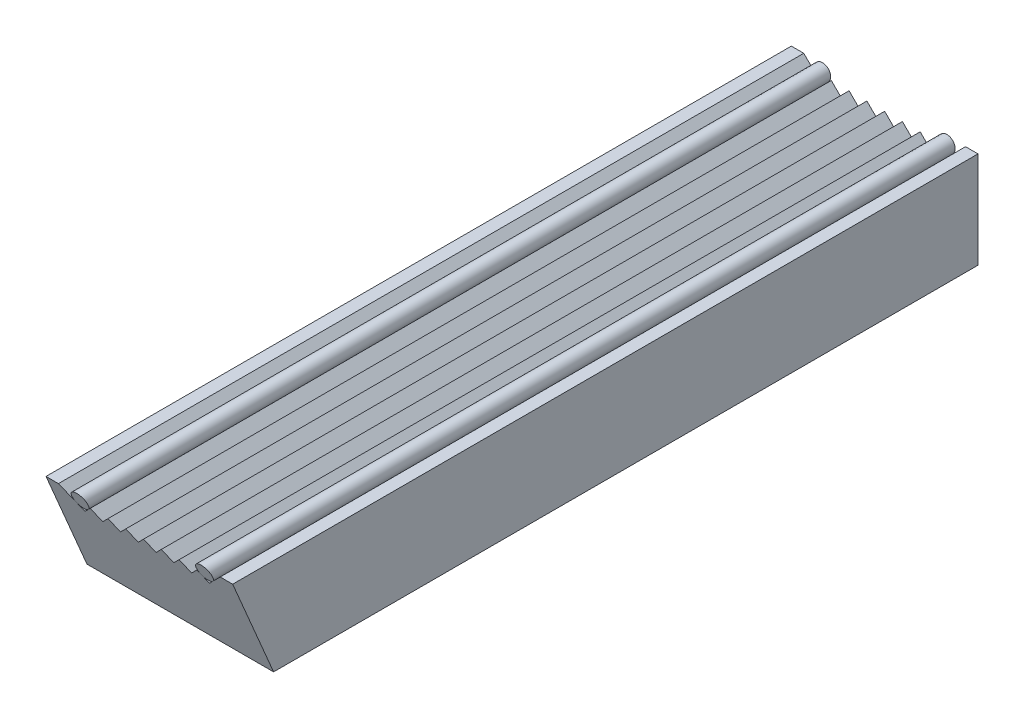
ISO-10303-21;
HEADER;
FILE_DESCRIPTION(('STEP AP214'),'2;1');
FILE_NAME('part.step','',(''),(''),'','','');
FILE_SCHEMA(('AUTOMOTIVE_DESIGN { 1 0 10303 214 1 1 1 1 }'));
ENDSEC;
DATA;
#1=APPLICATION_CONTEXT('core data for automotive mechanical design processes');
#2=APPLICATION_PROTOCOL_DEFINITION('international standard','automotive_design',2000,#1);
#3=PRODUCT_CONTEXT('',#1,'mechanical');
#4=PRODUCT('Part','Part','',(#3));
#5=PRODUCT_RELATED_PRODUCT_CATEGORY('part','',(#4));
#6=PRODUCT_DEFINITION_FORMATION('','',#4);
#7=PRODUCT_DEFINITION_CONTEXT('part definition',#1,'design');
#8=PRODUCT_DEFINITION('design','',#6,#7);
#9=PRODUCT_DEFINITION_SHAPE('','',#8);
#10=(LENGTH_UNIT() NAMED_UNIT(*) SI_UNIT(.MILLI.,.METRE.));
#11=(NAMED_UNIT(*) PLANE_ANGLE_UNIT() SI_UNIT($,.RADIAN.));
#12=(NAMED_UNIT(*) SI_UNIT($,.STERADIAN.) SOLID_ANGLE_UNIT());
#13=UNCERTAINTY_MEASURE_WITH_UNIT(LENGTH_MEASURE(1.E-05),#10,'distance_accuracy_value','');
#14=(GEOMETRIC_REPRESENTATION_CONTEXT(3) GLOBAL_UNCERTAINTY_ASSIGNED_CONTEXT((#13)) GLOBAL_UNIT_ASSIGNED_CONTEXT((#10,
#11,#12)) REPRESENTATION_CONTEXT('',''));
#15=CARTESIAN_POINT('',(0.,0.,0.));
#16=DIRECTION('',(0.,0.,1.));
#17=DIRECTION('',(1.,0.,0.));
#18=AXIS2_PLACEMENT_3D('',#15,#16,#17);
#19=CARTESIAN_POINT('',(0.5,-0.112548339959391,12.3220940394581));
#20=DIRECTION('',(0.,0.,-1.));
#21=DIRECTION('',(-1.,0.,0.));
#22=AXIS2_PLACEMENT_3D('',#19,#20,#21);
#23=CYLINDRICAL_SURFACE('',#22,0.13254833995939);
#24=CARTESIAN_POINT('',(0.5,-0.112548339959391,11.9310023232706));
#25=DIRECTION('',(0.,0.390731128489267,-0.920504853452443));
#26=DIRECTION('',(0.,-0.920504853452443,-0.390731128489267));
#27=AXIS2_PLACEMENT_3D('',#24,#25,#26);
#28=ELLIPSE('',#27,0.143995264622728,0.13254833995939);
#29=CARTESIAN_POINT('',(0.5,-0.245096679918781,11.8747388910274));
#30=VERTEX_POINT('',#29);
#31=EDGE_CURVE('E11',#30,#30,#28,.F.);
#32=ORIENTED_EDGE('',*,*,#31,.F.);
#33=EDGE_LOOP('',(#32));
#34=FACE_BOUND('',#33,.T.);
#35=CARTESIAN_POINT('',(0.5,-0.112548339959391,0.));
#36=DIRECTION('',(0.,0.,-1.));
#37=DIRECTION('',(-1.,0.,0.));
#38=AXIS2_PLACEMENT_3D('',#35,#36,#37);
#39=CIRCLE('',#38,0.13254833995939);
#40=CARTESIAN_POINT('',(0.36745166004061,-0.112548339959391,0.));
#41=VERTEX_POINT('',#40);
#42=EDGE_CURVE('E48',#41,#41,#39,.T.);
#43=ORIENTED_EDGE('',*,*,#42,.F.);
#44=EDGE_LOOP('',(#43));
#45=FACE_BOUND('',#44,.T.);
#46=ADVANCED_FACE('F42',(#34,#45),#23,.T.);
#47=CARTESIAN_POINT('',(0.5,-0.112548339959391,0.));
#48=DIRECTION('',(0.,0.,-1.));
#49=DIRECTION('',(-1.,0.,0.));
#50=AXIS2_PLACEMENT_3D('',#47,#48,#49);
#51=PLANE('',#50);
#52=ORIENTED_EDGE('',*,*,#42,.T.);
#53=EDGE_LOOP('',(#52));
#54=FACE_BOUND('',#53,.T.);
#55=ADVANCED_FACE('F54',(#54),#51,.T.);
#56=CARTESIAN_POINT('',(0.,0.0500000000000012,12.));
#57=DIRECTION('',(0.,0.390731128489267,-0.920504853452443));
#58=DIRECTION('',(0.,0.920504853452443,0.390731128489267));
#59=AXIS2_PLACEMENT_3D('',#56,#57,#58);
#60=PLANE('',#59);
#61=ORIENTED_EDGE('',*,*,#31,.T.);
#62=EDGE_LOOP('',(#61));
#63=FACE_BOUND('',#62,.T.);
#64=ADVANCED_FACE('F61',(#63),#60,.F.);
#65=CLOSED_SHELL('',(#46,#55,#64));
#66=MANIFOLD_SOLID_BREP('B2',#65);
#67=CARTESIAN_POINT('',(2.5,-0.11254833995939,12.3220940394581));
#68=DIRECTION('',(0.,0.,-1.));
#69=DIRECTION('',(-1.,0.,0.));
#70=AXIS2_PLACEMENT_3D('',#67,#68,#69);
#71=CYLINDRICAL_SURFACE('',#70,0.13254833995939);
#72=CARTESIAN_POINT('',(2.5,-0.11254833995939,11.9310023232706));
#73=DIRECTION('',(0.,0.390731128489267,-0.920504853452443));
#74=DIRECTION('',(0.,-0.920504853452443,-0.390731128489267));
#75=AXIS2_PLACEMENT_3D('',#72,#73,#74);
#76=ELLIPSE('',#75,0.143995264622728,0.13254833995939);
#77=CARTESIAN_POINT('',(2.5,-0.24509667991878,11.8747388910274));
#78=VERTEX_POINT('',#77);
#79=EDGE_CURVE('E41',#78,#78,#76,.F.);
#80=ORIENTED_EDGE('',*,*,#79,.F.);
#81=EDGE_LOOP('',(#80));
#82=FACE_BOUND('',#81,.T.);
#83=CARTESIAN_POINT('',(2.5,-0.11254833995939,0.));
#84=DIRECTION('',(0.,0.,-1.));
#85=DIRECTION('',(-1.,0.,0.));
#86=AXIS2_PLACEMENT_3D('',#83,#84,#85);
#87=CIRCLE('',#86,0.13254833995939);
#88=CARTESIAN_POINT('',(2.36745166004061,-0.11254833995939,0.));
#89=VERTEX_POINT('',#88);
#90=EDGE_CURVE('E92',#89,#89,#87,.T.);
#91=ORIENTED_EDGE('',*,*,#90,.F.);
#92=EDGE_LOOP('',(#91));
#93=FACE_BOUND('',#92,.T.);
#94=ADVANCED_FACE('F86',(#82,#93),#71,.T.);
#95=CARTESIAN_POINT('',(2.5,-0.11254833995939,0.));
#96=DIRECTION('',(0.,0.,-1.));
#97=DIRECTION('',(-1.,0.,0.));
#98=AXIS2_PLACEMENT_3D('',#95,#96,#97);
#99=PLANE('',#98);
#100=ORIENTED_EDGE('',*,*,#90,.T.);
#101=EDGE_LOOP('',(#100));
#102=FACE_BOUND('',#101,.T.);
#103=ADVANCED_FACE('F98',(#102),#99,.T.);
#104=CARTESIAN_POINT('',(0.,0.0500000000000012,12.));
#105=DIRECTION('',(0.,0.390731128489267,-0.920504853452443));
#106=DIRECTION('',(0.,0.920504853452443,0.390731128489267));
#107=AXIS2_PLACEMENT_3D('',#104,#105,#106);
#108=PLANE('',#107);
#109=ORIENTED_EDGE('',*,*,#79,.T.);
#110=EDGE_LOOP('',(#109));
#111=FACE_BOUND('',#110,.T.);
#112=ADVANCED_FACE('F105',(#111),#108,.F.);
#113=CLOSED_SHELL('',(#94,#103,#112));
#114=MANIFOLD_SOLID_BREP('B6',#113);
#115=CARTESIAN_POINT('',(3.,0.,12.));
#116=DIRECTION('',(0.,-1.,0.));
#117=DIRECTION('',(1.,0.,0.));
#118=AXIS2_PLACEMENT_3D('',#115,#116,#117);
#119=PLANE('',#118);
#120=DIRECTION('',(0.,0.,1.));
#121=VECTOR('',#120,1.);
#122=CARTESIAN_POINT('',(2.8,0.,0.));
#123=LINE('',#122,#121);
#124=CARTESIAN_POINT('',(2.8,0.,0.));
#125=VERTEX_POINT('',#124);
#126=CARTESIAN_POINT('',(2.8,0.,11.9787762591895));
#127=VERTEX_POINT('',#126);
#128=EDGE_CURVE('E355',#125,#127,#123,.T.);
#129=ORIENTED_EDGE('',*,*,#128,.T.);
#130=DIRECTION('',(1.,0.,0.));
#131=VECTOR('',#130,1.);
#132=CARTESIAN_POINT('',(3.,0.,11.9787762591895));
#133=LINE('',#132,#131);
#134=CARTESIAN_POINT('',(3.,0.,11.9787762591895));
#135=VERTEX_POINT('',#134);
#136=EDGE_CURVE('E403',#127,#135,#133,.T.);
#137=ORIENTED_EDGE('',*,*,#136,.T.);
#138=DIRECTION('',(0.,0.,-1.));
#139=VECTOR('',#138,1.);
#140=CARTESIAN_POINT('',(3.,0.,12.));
#141=LINE('',#140,#139);
#142=CARTESIAN_POINT('',(3.,0.,0.));
#143=VERTEX_POINT('',#142);
#144=EDGE_CURVE('E293',#135,#143,#141,.T.);
#145=ORIENTED_EDGE('',*,*,#144,.T.);
#146=DIRECTION('',(-1.,0.,0.));
#147=VECTOR('',#146,1.);
#148=CARTESIAN_POINT('',(3.,0.,0.));
#149=LINE('',#148,#147);
#150=EDGE_CURVE('E303',#143,#125,#149,.T.);
#151=ORIENTED_EDGE('',*,*,#150,.T.);
#152=EDGE_LOOP('',(#129,#137,#145,#151));
#153=FACE_BOUND('',#152,.T.);
#154=ADVANCED_FACE('F127',(#153),#119,.F.);
#155=DIRECTION('',(0.,0.,-1.));
#156=VECTOR('',#155,1.);
#157=CARTESIAN_POINT('',(0.,0.,12.));
#158=LINE('',#157,#156);
#159=CARTESIAN_POINT('',(0.,0.,11.9787762591895));
#160=VERTEX_POINT('',#159);
#161=CARTESIAN_POINT('',(0.,0.,0.));
#162=VERTEX_POINT('',#161);
#163=EDGE_CURVE('E135',#160,#162,#158,.T.);
#164=ORIENTED_EDGE('',*,*,#163,.F.);
#165=DIRECTION('',(1.,0.,0.));
#166=VECTOR('',#165,1.);
#167=CARTESIAN_POINT('',(3.,0.,11.9787762591895));
#168=LINE('',#167,#166);
#169=CARTESIAN_POINT('',(0.2,0.,11.9787762591895));
#170=VERTEX_POINT('',#169);
#171=EDGE_CURVE('E274',#160,#170,#168,.T.);
#172=ORIENTED_EDGE('',*,*,#171,.T.);
#173=DIRECTION('',(0.,0.,1.));
#174=VECTOR('',#173,1.);
#175=CARTESIAN_POINT('',(0.2,0.,0.));
#176=LINE('',#175,#174);
#177=CARTESIAN_POINT('',(0.2,0.,0.));
#178=VERTEX_POINT('',#177);
#179=EDGE_CURVE('E307',#178,#170,#176,.T.);
#180=ORIENTED_EDGE('',*,*,#179,.F.);
#181=EDGE_CURVE('E306',#178,#162,#149,.T.);
#182=ORIENTED_EDGE('',*,*,#181,.T.);
#183=EDGE_LOOP('',(#164,#172,#180,#182));
#184=FACE_BOUND('',#183,.T.);
#185=ADVANCED_FACE('F129',(#184),#119,.F.);
#186=CARTESIAN_POINT('',(0.,0.,12.));
#187=DIRECTION('',(1.,0.,0.));
#188=DIRECTION('',(0.,1.,0.));
#189=AXIS2_PLACEMENT_3D('',#186,#187,#188);
#190=PLANE('',#189);
#191=DIRECTION('',(0.,0.,-1.));
#192=VECTOR('',#191,1.);
#193=CARTESIAN_POINT('',(0.,-1.55,12.));
#194=LINE('',#193,#192);
#195=CARTESIAN_POINT('',(0.,-1.55,11.3208402940646));
#196=VERTEX_POINT('',#195);
#197=CARTESIAN_POINT('',(0.,-1.55,0.));
#198=VERTEX_POINT('',#197);
#199=EDGE_CURVE('E284',#196,#198,#194,.T.);
#200=ORIENTED_EDGE('',*,*,#199,.F.);
#201=DIRECTION('',(0.,0.920504853452443,0.390731128489267));
#202=VECTOR('',#201,1.);
#203=CARTESIAN_POINT('',(0.,0.0500000000000012,12.));
#204=LINE('',#203,#202);
#205=EDGE_CURVE('E268',#196,#160,#204,.T.);
#206=ORIENTED_EDGE('',*,*,#205,.T.);
#207=ORIENTED_EDGE('',*,*,#163,.T.);
#208=DIRECTION('',(0.,-1.,0.));
#209=VECTOR('',#208,1.);
#210=CARTESIAN_POINT('',(0.,0.,0.));
#211=LINE('',#210,#209);
#212=EDGE_CURVE('E290',#162,#198,#211,.T.);
#213=ORIENTED_EDGE('',*,*,#212,.T.);
#214=EDGE_LOOP('',(#200,#206,#207,#213));
#215=FACE_BOUND('',#214,.T.);
#216=ADVANCED_FACE('F288',(#215),#190,.F.);
#217=CARTESIAN_POINT('',(0.,-1.55,12.));
#218=DIRECTION('',(0.,1.,0.));
#219=DIRECTION('',(-1.,0.,0.));
#220=AXIS2_PLACEMENT_3D('',#217,#218,#219);
#221=PLANE('',#220);
#222=DIRECTION('',(0.,0.,-1.));
#223=VECTOR('',#222,1.);
#224=CARTESIAN_POINT('',(3.,-1.55,12.));
#225=LINE('',#224,#223);
#226=CARTESIAN_POINT('',(3.,-1.55,11.3208402940646));
#227=VERTEX_POINT('',#226);
#228=CARTESIAN_POINT('',(3.,-1.55,0.));
#229=VERTEX_POINT('',#228);
#230=EDGE_CURVE('E286',#227,#229,#225,.T.);
#231=ORIENTED_EDGE('',*,*,#230,.F.);
#232=DIRECTION('',(1.,0.,0.));
#233=VECTOR('',#232,1.);
#234=CARTESIAN_POINT('',(0.,-1.55,11.3208402940646));
#235=LINE('',#234,#233);
#236=EDGE_CURVE('E271',#196,#227,#235,.T.);
#237=ORIENTED_EDGE('',*,*,#236,.F.);
#238=ORIENTED_EDGE('',*,*,#199,.T.);
#239=DIRECTION('',(1.,0.,0.));
#240=VECTOR('',#239,1.);
#241=CARTESIAN_POINT('',(0.,-1.55,0.));
#242=LINE('',#241,#240);
#243=EDGE_CURVE('E300',#198,#229,#242,.T.);
#244=ORIENTED_EDGE('',*,*,#243,.T.);
#245=EDGE_LOOP('',(#231,#237,#238,#244));
#246=FACE_BOUND('',#245,.T.);
#247=ADVANCED_FACE('F282',(#246),#221,.F.);
#248=CARTESIAN_POINT('',(3.,-1.55,12.));
#249=DIRECTION('',(-1.,0.,0.));
#250=DIRECTION('',(0.,-1.,0.));
#251=AXIS2_PLACEMENT_3D('',#248,#249,#250);
#252=PLANE('',#251);
#253=ORIENTED_EDGE('',*,*,#144,.F.);
#254=DIRECTION('',(0.,0.920504853452443,0.390731128489267));
#255=VECTOR('',#254,1.);
#256=CARTESIAN_POINT('',(3.,0.0500000000000003,12.));
#257=LINE('',#256,#255);
#258=EDGE_CURVE('E278',#227,#135,#257,.T.);
#259=ORIENTED_EDGE('',*,*,#258,.F.);
#260=ORIENTED_EDGE('',*,*,#230,.T.);
#261=DIRECTION('',(0.,1.,0.));
#262=VECTOR('',#261,1.);
#263=CARTESIAN_POINT('',(3.,-1.55,0.));
#264=LINE('',#263,#262);
#265=EDGE_CURVE('E297',#229,#143,#264,.T.);
#266=ORIENTED_EDGE('',*,*,#265,.T.);
#267=EDGE_LOOP('',(#253,#259,#260,#266));
#268=FACE_BOUND('',#267,.T.);
#269=ADVANCED_FACE('F453',(#268),#252,.F.);
#270=CARTESIAN_POINT('',(0.,0.,0.));
#271=DIRECTION('',(0.,0.,1.));
#272=DIRECTION('',(1.,0.,0.));
#273=AXIS2_PLACEMENT_3D('',#270,#271,#272);
#274=PLANE('',#273);
#275=DIRECTION('',(0.707106781186544,-0.707106781186551,0.));
#276=VECTOR('',#275,1.);
#277=CARTESIAN_POINT('',(2.35714285714286,-0.157142857142857,0.));
#278=LINE('',#277,#276);
#279=CARTESIAN_POINT('',(2.35714285714286,-0.157142857142857,0.));
#280=VERTEX_POINT('',#279);
#281=CARTESIAN_POINT('',(2.5,-0.3,0.));
#282=VERTEX_POINT('',#281);
#283=EDGE_CURVE('E360',#280,#282,#278,.T.);
#284=ORIENTED_EDGE('',*,*,#283,.T.);
#285=DIRECTION('',(0.707106781186549,0.707106781186546,0.));
#286=VECTOR('',#285,1.);
#287=CARTESIAN_POINT('',(2.5,-0.3,0.));
#288=LINE('',#287,#286);
#289=EDGE_CURVE('E311',#282,#125,#288,.T.);
#290=ORIENTED_EDGE('',*,*,#289,.T.);
#291=ORIENTED_EDGE('',*,*,#150,.F.);
#292=ORIENTED_EDGE('',*,*,#265,.F.);
#293=ORIENTED_EDGE('',*,*,#243,.F.);
#294=ORIENTED_EDGE('',*,*,#212,.F.);
#295=ORIENTED_EDGE('',*,*,#181,.F.);
#296=DIRECTION('',(0.707106781186548,-0.707106781186547,0.));
#297=VECTOR('',#296,1.);
#298=CARTESIAN_POINT('',(0.2,0.,0.));
#299=LINE('',#298,#297);
#300=CARTESIAN_POINT('',(0.5,-0.3,0.));
#301=VERTEX_POINT('',#300);
#302=EDGE_CURVE('E400',#178,#301,#299,.T.);
#303=ORIENTED_EDGE('',*,*,#302,.T.);
#304=DIRECTION('',(0.707106781186549,0.707106781186546,0.));
#305=VECTOR('',#304,1.);
#306=CARTESIAN_POINT('',(0.5,-0.3,0.));
#307=LINE('',#306,#305);
#308=CARTESIAN_POINT('',(0.642857142857144,-0.157142857142857,0.));
#309=VERTEX_POINT('',#308);
#310=EDGE_CURVE('E149',#301,#309,#307,.T.);
#311=ORIENTED_EDGE('',*,*,#310,.T.);
#312=DIRECTION('',(0.707106781186547,-0.707106781186548,0.));
#313=VECTOR('',#312,1.);
#314=CARTESIAN_POINT('',(0.642857142857144,-0.157142857142857,0.));
#315=LINE('',#314,#313);
#316=CARTESIAN_POINT('',(0.785714285714286,-0.3,0.));
#317=VERTEX_POINT('',#316);
#318=EDGE_CURVE('E396',#309,#317,#315,.T.);
#319=ORIENTED_EDGE('',*,*,#318,.T.);
#320=DIRECTION('',(0.707106781186548,0.707106781186547,0.));
#321=VECTOR('',#320,1.);
#322=CARTESIAN_POINT('',(0.785714285714286,-0.3,0.));
#323=LINE('',#322,#321);
#324=CARTESIAN_POINT('',(0.928571428571429,-0.157142857142857,0.));
#325=VERTEX_POINT('',#324);
#326=EDGE_CURVE('E393',#317,#325,#323,.T.);
#327=ORIENTED_EDGE('',*,*,#326,.T.);
#328=DIRECTION('',(0.707106781186546,-0.707106781186549,0.));
#329=VECTOR('',#328,1.);
#330=CARTESIAN_POINT('',(0.928571428571429,-0.157142857142857,0.));
#331=LINE('',#330,#329);
#332=CARTESIAN_POINT('',(1.07142857142857,-0.3,0.));
#333=VERTEX_POINT('',#332);
#334=EDGE_CURVE('E390',#325,#333,#331,.T.);
#335=ORIENTED_EDGE('',*,*,#334,.T.);
#336=DIRECTION('',(0.707106781186549,0.707106781186546,0.));
#337=VECTOR('',#336,1.);
#338=CARTESIAN_POINT('',(1.07142857142857,-0.3,0.));
#339=LINE('',#338,#337);
#340=CARTESIAN_POINT('',(1.21428571428572,-0.157142857142857,0.));
#341=VERTEX_POINT('',#340);
#342=EDGE_CURVE('E387',#333,#341,#339,.T.);
#343=ORIENTED_EDGE('',*,*,#342,.T.);
#344=DIRECTION('',(0.707106781186546,-0.707106781186549,0.));
#345=VECTOR('',#344,1.);
#346=CARTESIAN_POINT('',(1.21428571428572,-0.157142857142857,0.));
#347=LINE('',#346,#345);
#348=CARTESIAN_POINT('',(1.35714285714286,-0.3,0.));
#349=VERTEX_POINT('',#348);
#350=EDGE_CURVE('E384',#341,#349,#347,.T.);
#351=ORIENTED_EDGE('',*,*,#350,.T.);
#352=DIRECTION('',(0.707106781186548,0.707106781186547,0.));
#353=VECTOR('',#352,1.);
#354=CARTESIAN_POINT('',(1.35714285714286,-0.3,0.));
#355=LINE('',#354,#353);
#356=CARTESIAN_POINT('',(1.5,-0.157142857142857,0.));
#357=VERTEX_POINT('',#356);
#358=EDGE_CURVE('E381',#349,#357,#355,.T.);
#359=ORIENTED_EDGE('',*,*,#358,.T.);
#360=DIRECTION('',(0.707106781186546,-0.707106781186549,0.));
#361=VECTOR('',#360,1.);
#362=CARTESIAN_POINT('',(1.5,-0.157142857142857,0.));
#363=LINE('',#362,#361);
#364=CARTESIAN_POINT('',(1.64285714285714,-0.3,0.));
#365=VERTEX_POINT('',#364);
#366=EDGE_CURVE('E378',#357,#365,#363,.T.);
#367=ORIENTED_EDGE('',*,*,#366,.T.);
#368=DIRECTION('',(0.70710678118655,0.707106781186545,0.));
#369=VECTOR('',#368,1.);
#370=CARTESIAN_POINT('',(1.64285714285714,-0.3,0.));
#371=LINE('',#370,#369);
#372=CARTESIAN_POINT('',(1.78571428571429,-0.157142857142857,0.));
#373=VERTEX_POINT('',#372);
#374=EDGE_CURVE('E375',#365,#373,#371,.T.);
#375=ORIENTED_EDGE('',*,*,#374,.T.);
#376=DIRECTION('',(0.707106781186546,-0.707106781186549,0.));
#377=VECTOR('',#376,1.);
#378=CARTESIAN_POINT('',(1.78571428571429,-0.157142857142857,0.));
#379=LINE('',#378,#377);
#380=CARTESIAN_POINT('',(1.92857142857143,-0.3,0.));
#381=VERTEX_POINT('',#380);
#382=EDGE_CURVE('E372',#373,#381,#379,.T.);
#383=ORIENTED_EDGE('',*,*,#382,.T.);
#384=DIRECTION('',(0.70710678118655,0.707106781186545,0.));
#385=VECTOR('',#384,1.);
#386=CARTESIAN_POINT('',(1.92857142857143,-0.3,0.));
#387=LINE('',#386,#385);
#388=CARTESIAN_POINT('',(2.07142857142857,-0.157142857142857,0.));
#389=VERTEX_POINT('',#388);
#390=EDGE_CURVE('E369',#381,#389,#387,.T.);
#391=ORIENTED_EDGE('',*,*,#390,.T.);
#392=DIRECTION('',(0.707106781186546,-0.707106781186549,0.));
#393=VECTOR('',#392,1.);
#394=CARTESIAN_POINT('',(2.07142857142857,-0.157142857142857,0.));
#395=LINE('',#394,#393);
#396=CARTESIAN_POINT('',(2.21428571428571,-0.3,0.));
#397=VERTEX_POINT('',#396);
#398=EDGE_CURVE('E366',#389,#397,#395,.T.);
#399=ORIENTED_EDGE('',*,*,#398,.T.);
#400=DIRECTION('',(0.70710678118655,0.707106781186545,0.));
#401=VECTOR('',#400,1.);
#402=CARTESIAN_POINT('',(2.21428571428571,-0.3,0.));
#403=LINE('',#402,#401);
#404=EDGE_CURVE('E363',#397,#280,#403,.T.);
#405=ORIENTED_EDGE('',*,*,#404,.T.);
#406=EDGE_LOOP('',(#284,#290,#291,#292,#293,#294,#295,#303,#311,#319,#327,#335,#343,#351,#359,
#367,#375,#383,#391,#399,#405));
#407=FACE_BOUND('',#406,.T.);
#408=ADVANCED_FACE('F457',(#407),#274,.F.);
#409=CARTESIAN_POINT('',(2.5,-0.3,0.));
#410=DIRECTION('',(0.707106781186546,-0.707106781186549,0.));
#411=DIRECTION('',(0.707106781186549,0.707106781186546,0.));
#412=AXIS2_PLACEMENT_3D('',#409,#410,#411);
#413=PLANE('',#412);
#414=DIRECTION('',(0.,0.,1.));
#415=VECTOR('',#414,1.);
#416=CARTESIAN_POINT('',(2.5,-0.3,0.));
#417=LINE('',#416,#415);
#418=CARTESIAN_POINT('',(2.5,-0.3,11.8514338143266));
#419=VERTEX_POINT('',#418);
#420=EDGE_CURVE('E352',#282,#419,#417,.T.);
#421=ORIENTED_EDGE('',*,*,#420,.T.);
#422=DIRECTION('',(0.677257677459684,0.677257677459682,0.287478828166236));
#423=VECTOR('',#422,1.);
#424=CARTESIAN_POINT('',(0.192558505032979,-2.60744149496701,10.8719830098361));
#425=LINE('',#424,#423);
#426=EDGE_CURVE('E407',#419,#127,#425,.T.);
#427=ORIENTED_EDGE('',*,*,#426,.T.);
#428=ORIENTED_EDGE('',*,*,#128,.F.);
#429=ORIENTED_EDGE('',*,*,#289,.F.);
#430=EDGE_LOOP('',(#421,#427,#428,#429));
#431=FACE_BOUND('',#430,.T.);
#432=ADVANCED_FACE('F461',(#431),#413,.F.);
#433=CARTESIAN_POINT('',(2.35714285714286,-0.157142857142857,0.));
#434=DIRECTION('',(-0.707106781186551,-0.707106781186544,0.));
#435=DIRECTION('',(0.707106781186544,-0.707106781186551,0.));
#436=AXIS2_PLACEMENT_3D('',#433,#434,#435);
#437=PLANE('',#436);
#438=DIRECTION('',(0.,0.,1.));
#439=VECTOR('',#438,1.);
#440=CARTESIAN_POINT('',(2.35714285714286,-0.157142857142857,0.));
#441=LINE('',#440,#439);
#442=CARTESIAN_POINT('',(2.35714285714286,-0.157142857142858,11.9120730737852));
#443=VERTEX_POINT('',#442);
#444=EDGE_CURVE('E349',#280,#443,#441,.T.);
#445=ORIENTED_EDGE('',*,*,#444,.T.);
#446=DIRECTION('',(0.677257677459679,-0.677257677459686,-0.287478828166238));
#447=VECTOR('',#446,1.);
#448=CARTESIAN_POINT('',(4.67639064877328,-2.4763906487733,10.9276107936883));
#449=LINE('',#448,#447);
#450=EDGE_CURVE('E410',#443,#419,#449,.T.);
#451=ORIENTED_EDGE('',*,*,#450,.T.);
#452=ORIENTED_EDGE('',*,*,#420,.F.);
#453=ORIENTED_EDGE('',*,*,#283,.F.);
#454=EDGE_LOOP('',(#445,#451,#452,#453));
#455=FACE_BOUND('',#454,.T.);
#456=ADVANCED_FACE('F463',(#455),#437,.F.);
#457=CARTESIAN_POINT('',(2.21428571428571,-0.3,0.));
#458=DIRECTION('',(0.707106781186545,-0.70710678118655,0.));
#459=DIRECTION('',(0.70710678118655,0.707106781186545,0.));
#460=AXIS2_PLACEMENT_3D('',#457,#458,#459);
#461=PLANE('',#460);
#462=DIRECTION('',(0.,0.,1.));
#463=VECTOR('',#462,1.);
#464=CARTESIAN_POINT('',(2.21428571428571,-0.3,0.));
#465=LINE('',#464,#463);
#466=CARTESIAN_POINT('',(2.21428571428571,-0.3,11.8514338143266));
#467=VERTEX_POINT('',#466);
#468=EDGE_CURVE('E346',#397,#467,#465,.T.);
#469=ORIENTED_EDGE('',*,*,#468,.T.);
#470=DIRECTION('',(0.677257677459685,0.677257677459681,0.287478828166236));
#471=VECTOR('',#470,1.);
#472=CARTESIAN_POINT('',(-0.0931557806813071,-2.60744149496701,10.8719830098361));
#473=LINE('',#472,#471);
#474=EDGE_CURVE('E413',#467,#443,#473,.T.);
#475=ORIENTED_EDGE('',*,*,#474,.T.);
#476=ORIENTED_EDGE('',*,*,#444,.F.);
#477=ORIENTED_EDGE('',*,*,#404,.F.);
#478=EDGE_LOOP('',(#469,#475,#476,#477));
#479=FACE_BOUND('',#478,.T.);
#480=ADVANCED_FACE('F466',(#479),#461,.F.);
#481=CARTESIAN_POINT('',(2.07142857142857,-0.157142857142857,0.));
#482=DIRECTION('',(-0.707106781186549,-0.707106781186546,0.));
#483=DIRECTION('',(0.707106781186546,-0.707106781186549,0.));
#484=AXIS2_PLACEMENT_3D('',#481,#482,#483);
#485=PLANE('',#484);
#486=DIRECTION('',(0.,0.,1.));
#487=VECTOR('',#486,1.);
#488=CARTESIAN_POINT('',(2.07142857142857,-0.157142857142857,0.));
#489=LINE('',#488,#487);
#490=CARTESIAN_POINT('',(2.07142857142857,-0.157142857142857,11.9120730737852));
#491=VERTEX_POINT('',#490);
#492=EDGE_CURVE('E343',#389,#491,#489,.T.);
#493=ORIENTED_EDGE('',*,*,#492,.T.);
#494=DIRECTION('',(0.677257677459681,-0.677257677459684,-0.287478828166237));
#495=VECTOR('',#494,1.);
#496=CARTESIAN_POINT('',(4.39067636305899,-2.47639064877329,10.9276107936883));
#497=LINE('',#496,#495);
#498=EDGE_CURVE('E416',#491,#467,#497,.T.);
#499=ORIENTED_EDGE('',*,*,#498,.T.);
#500=ORIENTED_EDGE('',*,*,#468,.F.);
#501=ORIENTED_EDGE('',*,*,#398,.F.);
#502=EDGE_LOOP('',(#493,#499,#500,#501));
#503=FACE_BOUND('',#502,.T.);
#504=ADVANCED_FACE('F468',(#503),#485,.F.);
#505=CARTESIAN_POINT('',(1.92857142857143,-0.3,0.));
#506=DIRECTION('',(0.707106781186545,-0.707106781186549,0.));
#507=DIRECTION('',(0.70710678118655,0.707106781186545,0.));
#508=AXIS2_PLACEMENT_3D('',#505,#506,#507);
#509=PLANE('',#508);
#510=DIRECTION('',(0.,0.,1.));
#511=VECTOR('',#510,1.);
#512=CARTESIAN_POINT('',(1.92857142857143,-0.3,0.));
#513=LINE('',#512,#511);
#514=CARTESIAN_POINT('',(1.92857142857143,-0.3,11.8514338143266));
#515=VERTEX_POINT('',#514);
#516=EDGE_CURVE('E340',#381,#515,#513,.T.);
#517=ORIENTED_EDGE('',*,*,#516,.T.);
#518=DIRECTION('',(0.677257677459685,0.677257677459681,0.287478828166236));
#519=VECTOR('',#518,1.);
#520=CARTESIAN_POINT('',(-0.378870066395593,-2.60744149496701,10.8719830098361));
#521=LINE('',#520,#519);
#522=EDGE_CURVE('E419',#515,#491,#521,.T.);
#523=ORIENTED_EDGE('',*,*,#522,.T.);
#524=ORIENTED_EDGE('',*,*,#492,.F.);
#525=ORIENTED_EDGE('',*,*,#390,.F.);
#526=EDGE_LOOP('',(#517,#523,#524,#525));
#527=FACE_BOUND('',#526,.T.);
#528=ADVANCED_FACE('F472',(#527),#509,.F.);
#529=CARTESIAN_POINT('',(1.78571428571429,-0.157142857142857,0.));
#530=DIRECTION('',(-0.707106781186549,-0.707106781186546,0.));
#531=DIRECTION('',(0.707106781186546,-0.707106781186549,0.));
#532=AXIS2_PLACEMENT_3D('',#529,#530,#531);
#533=PLANE('',#532);
#534=DIRECTION('',(0.,0.,1.));
#535=VECTOR('',#534,1.);
#536=CARTESIAN_POINT('',(1.78571428571429,-0.157142857142857,0.));
#537=LINE('',#536,#535);
#538=CARTESIAN_POINT('',(1.78571428571429,-0.157142857142857,11.9120730737852));
#539=VERTEX_POINT('',#538);
#540=EDGE_CURVE('E337',#373,#539,#537,.T.);
#541=ORIENTED_EDGE('',*,*,#540,.T.);
#542=DIRECTION('',(0.677257677459681,-0.677257677459684,-0.287478828166237));
#543=VECTOR('',#542,1.);
#544=CARTESIAN_POINT('',(4.10496207734471,-2.47639064877329,10.9276107936883));
#545=LINE('',#544,#543);
#546=EDGE_CURVE('E422',#539,#515,#545,.T.);
#547=ORIENTED_EDGE('',*,*,#546,.T.);
#548=ORIENTED_EDGE('',*,*,#516,.F.);
#549=ORIENTED_EDGE('',*,*,#382,.F.);
#550=EDGE_LOOP('',(#541,#547,#548,#549));
#551=FACE_BOUND('',#550,.T.);
#552=ADVANCED_FACE('F474',(#551),#533,.F.);
#553=CARTESIAN_POINT('',(1.64285714285714,-0.3,0.));
#554=DIRECTION('',(0.707106781186545,-0.70710678118655,0.));
#555=DIRECTION('',(0.70710678118655,0.707106781186545,0.));
#556=AXIS2_PLACEMENT_3D('',#553,#554,#555);
#557=PLANE('',#556);
#558=DIRECTION('',(0.,0.,1.));
#559=VECTOR('',#558,1.);
#560=CARTESIAN_POINT('',(1.64285714285714,-0.3,0.));
#561=LINE('',#560,#559);
#562=CARTESIAN_POINT('',(1.64285714285714,-0.3,11.8514338143266));
#563=VERTEX_POINT('',#562);
#564=EDGE_CURVE('E334',#365,#563,#561,.T.);
#565=ORIENTED_EDGE('',*,*,#564,.T.);
#566=DIRECTION('',(0.677257677459685,0.677257677459681,0.287478828166236));
#567=VECTOR('',#566,1.);
#568=CARTESIAN_POINT('',(-0.664584352109878,-2.60744149496701,10.8719830098361));
#569=LINE('',#568,#567);
#570=EDGE_CURVE('E425',#563,#539,#569,.T.);
#571=ORIENTED_EDGE('',*,*,#570,.T.);
#572=ORIENTED_EDGE('',*,*,#540,.F.);
#573=ORIENTED_EDGE('',*,*,#374,.F.);
#574=EDGE_LOOP('',(#565,#571,#572,#573));
#575=FACE_BOUND('',#574,.T.);
#576=ADVANCED_FACE('F478',(#575),#557,.F.);
#577=CARTESIAN_POINT('',(1.5,-0.157142857142857,0.));
#578=DIRECTION('',(-0.707106781186549,-0.707106781186546,0.));
#579=DIRECTION('',(0.707106781186546,-0.707106781186549,0.));
#580=AXIS2_PLACEMENT_3D('',#577,#578,#579);
#581=PLANE('',#580);
#582=DIRECTION('',(0.,0.,1.));
#583=VECTOR('',#582,1.);
#584=CARTESIAN_POINT('',(1.5,-0.157142857142857,0.));
#585=LINE('',#584,#583);
#586=CARTESIAN_POINT('',(1.5,-0.157142857142857,11.9120730737852));
#587=VERTEX_POINT('',#586);
#588=EDGE_CURVE('E331',#357,#587,#585,.T.);
#589=ORIENTED_EDGE('',*,*,#588,.T.);
#590=DIRECTION('',(0.677257677459681,-0.677257677459684,-0.287478828166237));
#591=VECTOR('',#590,1.);
#592=CARTESIAN_POINT('',(3.81924779163042,-2.47639064877329,10.9276107936883));
#593=LINE('',#592,#591);
#594=EDGE_CURVE('E428',#587,#563,#593,.T.);
#595=ORIENTED_EDGE('',*,*,#594,.T.);
#596=ORIENTED_EDGE('',*,*,#564,.F.);
#597=ORIENTED_EDGE('',*,*,#366,.F.);
#598=EDGE_LOOP('',(#589,#595,#596,#597));
#599=FACE_BOUND('',#598,.T.);
#600=ADVANCED_FACE('F480',(#599),#581,.F.);
#601=CARTESIAN_POINT('',(1.35714285714286,-0.3,0.));
#602=DIRECTION('',(0.707106781186547,-0.707106781186548,0.));
#603=DIRECTION('',(0.707106781186548,0.707106781186547,0.));
#604=AXIS2_PLACEMENT_3D('',#601,#602,#603);
#605=PLANE('',#604);
#606=DIRECTION('',(0.,0.,1.));
#607=VECTOR('',#606,1.);
#608=CARTESIAN_POINT('',(1.35714285714286,-0.3,0.));
#609=LINE('',#608,#607);
#610=CARTESIAN_POINT('',(1.35714285714286,-0.3,11.8514338143266));
#611=VERTEX_POINT('',#610);
#612=EDGE_CURVE('E328',#349,#611,#609,.T.);
#613=ORIENTED_EDGE('',*,*,#612,.T.);
#614=DIRECTION('',(0.677257677459684,0.677257677459682,0.287478828166236));
#615=VECTOR('',#614,1.);
#616=CARTESIAN_POINT('',(-0.950298637824163,-2.60744149496701,10.8719830098361));
#617=LINE('',#616,#615);
#618=EDGE_CURVE('E431',#611,#587,#617,.T.);
#619=ORIENTED_EDGE('',*,*,#618,.T.);
#620=ORIENTED_EDGE('',*,*,#588,.F.);
#621=ORIENTED_EDGE('',*,*,#358,.F.);
#622=EDGE_LOOP('',(#613,#619,#620,#621));
#623=FACE_BOUND('',#622,.T.);
#624=ADVANCED_FACE('F484',(#623),#605,.F.);
#625=CARTESIAN_POINT('',(1.21428571428572,-0.157142857142857,0.));
#626=DIRECTION('',(-0.707106781186549,-0.707106781186546,0.));
#627=DIRECTION('',(0.707106781186546,-0.707106781186549,0.));
#628=AXIS2_PLACEMENT_3D('',#625,#626,#627);
#629=PLANE('',#628);
#630=DIRECTION('',(0.,0.,1.));
#631=VECTOR('',#630,1.);
#632=CARTESIAN_POINT('',(1.21428571428572,-0.157142857142857,0.));
#633=LINE('',#632,#631);
#634=CARTESIAN_POINT('',(1.21428571428572,-0.157142857142857,11.9120730737852));
#635=VERTEX_POINT('',#634);
#636=EDGE_CURVE('E325',#341,#635,#633,.T.);
#637=ORIENTED_EDGE('',*,*,#636,.T.);
#638=DIRECTION('',(0.677257677459681,-0.677257677459684,-0.287478828166237));
#639=VECTOR('',#638,1.);
#640=CARTESIAN_POINT('',(3.53353350591614,-2.47639064877329,10.9276107936883));
#641=LINE('',#640,#639);
#642=EDGE_CURVE('E434',#635,#611,#641,.T.);
#643=ORIENTED_EDGE('',*,*,#642,.T.);
#644=ORIENTED_EDGE('',*,*,#612,.F.);
#645=ORIENTED_EDGE('',*,*,#350,.F.);
#646=EDGE_LOOP('',(#637,#643,#644,#645));
#647=FACE_BOUND('',#646,.T.);
#648=ADVANCED_FACE('F486',(#647),#629,.F.);
#649=CARTESIAN_POINT('',(1.07142857142857,-0.3,0.));
#650=DIRECTION('',(0.707106781186546,-0.707106781186549,0.));
#651=DIRECTION('',(0.707106781186549,0.707106781186546,0.));
#652=AXIS2_PLACEMENT_3D('',#649,#650,#651);
#653=PLANE('',#652);
#654=DIRECTION('',(0.,0.,1.));
#655=VECTOR('',#654,1.);
#656=CARTESIAN_POINT('',(1.07142857142857,-0.3,0.));
#657=LINE('',#656,#655);
#658=CARTESIAN_POINT('',(1.07142857142857,-0.3,11.8514338143266));
#659=VERTEX_POINT('',#658);
#660=EDGE_CURVE('E322',#333,#659,#657,.T.);
#661=ORIENTED_EDGE('',*,*,#660,.T.);
#662=DIRECTION('',(0.677257677459684,0.677257677459681,0.287478828166236));
#663=VECTOR('',#662,1.);
#664=CARTESIAN_POINT('',(-1.23601292353845,-2.60744149496701,10.8719830098361));
#665=LINE('',#664,#663);
#666=EDGE_CURVE('E437',#659,#635,#665,.T.);
#667=ORIENTED_EDGE('',*,*,#666,.T.);
#668=ORIENTED_EDGE('',*,*,#636,.F.);
#669=ORIENTED_EDGE('',*,*,#342,.F.);
#670=EDGE_LOOP('',(#661,#667,#668,#669));
#671=FACE_BOUND('',#670,.T.);
#672=ADVANCED_FACE('F490',(#671),#653,.F.);
#673=CARTESIAN_POINT('',(0.928571428571429,-0.157142857142857,0.));
#674=DIRECTION('',(-0.707106781186549,-0.707106781186546,0.));
#675=DIRECTION('',(0.707106781186546,-0.707106781186549,0.));
#676=AXIS2_PLACEMENT_3D('',#673,#674,#675);
#677=PLANE('',#676);
#678=DIRECTION('',(0.,0.,1.));
#679=VECTOR('',#678,1.);
#680=CARTESIAN_POINT('',(0.928571428571429,-0.157142857142857,0.));
#681=LINE('',#680,#679);
#682=CARTESIAN_POINT('',(0.928571428571429,-0.157142857142857,11.9120730737852));
#683=VERTEX_POINT('',#682);
#684=EDGE_CURVE('E319',#325,#683,#681,.T.);
#685=ORIENTED_EDGE('',*,*,#684,.T.);
#686=DIRECTION('',(0.677257677459681,-0.677257677459684,-0.287478828166237));
#687=VECTOR('',#686,1.);
#688=CARTESIAN_POINT('',(3.24781922020185,-2.47639064877329,10.9276107936883));
#689=LINE('',#688,#687);
#690=EDGE_CURVE('E440',#683,#659,#689,.T.);
#691=ORIENTED_EDGE('',*,*,#690,.T.);
#692=ORIENTED_EDGE('',*,*,#660,.F.);
#693=ORIENTED_EDGE('',*,*,#334,.F.);
#694=EDGE_LOOP('',(#685,#691,#692,#693));
#695=FACE_BOUND('',#694,.T.);
#696=ADVANCED_FACE('F492',(#695),#677,.F.);
#697=CARTESIAN_POINT('',(0.785714285714286,-0.3,0.));
#698=DIRECTION('',(0.707106781186547,-0.707106781186548,0.));
#699=DIRECTION('',(0.707106781186548,0.707106781186547,0.));
#700=AXIS2_PLACEMENT_3D('',#697,#698,#699);
#701=PLANE('',#700);
#702=DIRECTION('',(0.,0.,1.));
#703=VECTOR('',#702,1.);
#704=CARTESIAN_POINT('',(0.785714285714286,-0.3,0.));
#705=LINE('',#704,#703);
#706=CARTESIAN_POINT('',(0.785714285714286,-0.3,11.8514338143266));
#707=VERTEX_POINT('',#706);
#708=EDGE_CURVE('E316',#317,#707,#705,.T.);
#709=ORIENTED_EDGE('',*,*,#708,.T.);
#710=DIRECTION('',(0.677257677459683,0.677257677459682,0.287478828166237));
#711=VECTOR('',#710,1.);
#712=CARTESIAN_POINT('',(-1.52172720925273,-2.60744149496702,10.8719830098361));
#713=LINE('',#712,#711);
#714=EDGE_CURVE('E443',#707,#683,#713,.T.);
#715=ORIENTED_EDGE('',*,*,#714,.T.);
#716=ORIENTED_EDGE('',*,*,#684,.F.);
#717=ORIENTED_EDGE('',*,*,#326,.F.);
#718=EDGE_LOOP('',(#709,#715,#716,#717));
#719=FACE_BOUND('',#718,.T.);
#720=ADVANCED_FACE('F496',(#719),#701,.F.);
#721=CARTESIAN_POINT('',(0.642857142857144,-0.157142857142857,0.));
#722=DIRECTION('',(-0.707106781186548,-0.707106781186547,0.));
#723=DIRECTION('',(0.707106781186547,-0.707106781186548,0.));
#724=AXIS2_PLACEMENT_3D('',#721,#722,#723);
#725=PLANE('',#724);
#726=DIRECTION('',(0.,0.,1.));
#727=VECTOR('',#726,1.);
#728=CARTESIAN_POINT('',(0.642857142857144,-0.157142857142857,0.));
#729=LINE('',#728,#727);
#730=CARTESIAN_POINT('',(0.642857142857144,-0.157142857142857,11.9120730737852));
#731=VERTEX_POINT('',#730);
#732=EDGE_CURVE('E313',#309,#731,#729,.T.);
#733=ORIENTED_EDGE('',*,*,#732,.T.);
#734=DIRECTION('',(0.677257677459683,-0.677257677459683,-0.287478828166237));
#735=VECTOR('',#734,1.);
#736=CARTESIAN_POINT('',(2.96210493448757,-2.47639064877328,10.9276107936883));
#737=LINE('',#736,#735);
#738=EDGE_CURVE('E446',#731,#707,#737,.T.);
#739=ORIENTED_EDGE('',*,*,#738,.T.);
#740=ORIENTED_EDGE('',*,*,#708,.F.);
#741=ORIENTED_EDGE('',*,*,#318,.F.);
#742=EDGE_LOOP('',(#733,#739,#740,#741));
#743=FACE_BOUND('',#742,.T.);
#744=ADVANCED_FACE('F498',(#743),#725,.F.);
#745=CARTESIAN_POINT('',(0.5,-0.3,0.));
#746=DIRECTION('',(0.707106781186546,-0.707106781186549,0.));
#747=DIRECTION('',(0.707106781186549,0.707106781186546,0.));
#748=AXIS2_PLACEMENT_3D('',#745,#746,#747);
#749=PLANE('',#748);
#750=DIRECTION('',(0.,0.,1.));
#751=VECTOR('',#750,1.);
#752=CARTESIAN_POINT('',(0.5,-0.3,0.));
#753=LINE('',#752,#751);
#754=CARTESIAN_POINT('',(0.5,-0.3,11.8514338143266));
#755=VERTEX_POINT('',#754);
#756=EDGE_CURVE('E310',#301,#755,#753,.T.);
#757=ORIENTED_EDGE('',*,*,#756,.T.);
#758=DIRECTION('',(0.677257677459685,0.677257677459681,0.287478828166236));
#759=VECTOR('',#758,1.);
#760=CARTESIAN_POINT('',(-1.80744149496702,-2.60744149496701,10.8719830098361));
#761=LINE('',#760,#759);
#762=EDGE_CURVE('E142',#755,#731,#761,.T.);
#763=ORIENTED_EDGE('',*,*,#762,.T.);
#764=ORIENTED_EDGE('',*,*,#732,.F.);
#765=ORIENTED_EDGE('',*,*,#310,.F.);
#766=EDGE_LOOP('',(#757,#763,#764,#765));
#767=FACE_BOUND('',#766,.T.);
#768=ADVANCED_FACE('F500',(#767),#749,.F.);
#769=CARTESIAN_POINT('',(0.2,0.,0.));
#770=DIRECTION('',(-0.707106781186547,-0.707106781186548,0.));
#771=DIRECTION('',(0.707106781186548,-0.707106781186547,0.));
#772=AXIS2_PLACEMENT_3D('',#769,#770,#771);
#773=PLANE('',#772);
#774=ORIENTED_EDGE('',*,*,#179,.T.);
#775=DIRECTION('',(0.677257677459683,-0.677257677459683,-0.287478828166237));
#776=VECTOR('',#775,1.);
#777=CARTESIAN_POINT('',(2.53223471796017,-2.33223471796017,10.9888013559257));
#778=LINE('',#777,#776);
#779=EDGE_CURVE('E84',#170,#755,#778,.T.);
#780=ORIENTED_EDGE('',*,*,#779,.T.);
#781=ORIENTED_EDGE('',*,*,#756,.F.);
#782=ORIENTED_EDGE('',*,*,#302,.F.);
#783=EDGE_LOOP('',(#774,#780,#781,#782));
#784=FACE_BOUND('',#783,.T.);
#785=ADVANCED_FACE('F502',(#784),#773,.F.);
#786=CARTESIAN_POINT('',(0.,0.0500000000000012,12.));
#787=DIRECTION('',(0.,0.390731128489267,-0.920504853452443));
#788=DIRECTION('',(0.,0.920504853452443,0.390731128489267));
#789=AXIS2_PLACEMENT_3D('',#786,#787,#788);
#790=PLANE('',#789);
#791=ORIENTED_EDGE('',*,*,#426,.F.);
#792=ORIENTED_EDGE('',*,*,#450,.F.);
#793=ORIENTED_EDGE('',*,*,#474,.F.);
#794=ORIENTED_EDGE('',*,*,#498,.F.);
#795=ORIENTED_EDGE('',*,*,#522,.F.);
#796=ORIENTED_EDGE('',*,*,#546,.F.);
#797=ORIENTED_EDGE('',*,*,#570,.F.);
#798=ORIENTED_EDGE('',*,*,#594,.F.);
#799=ORIENTED_EDGE('',*,*,#618,.F.);
#800=ORIENTED_EDGE('',*,*,#642,.F.);
#801=ORIENTED_EDGE('',*,*,#666,.F.);
#802=ORIENTED_EDGE('',*,*,#690,.F.);
#803=ORIENTED_EDGE('',*,*,#714,.F.);
#804=ORIENTED_EDGE('',*,*,#738,.F.);
#805=ORIENTED_EDGE('',*,*,#762,.F.);
#806=ORIENTED_EDGE('',*,*,#779,.F.);
#807=ORIENTED_EDGE('',*,*,#171,.F.);
#808=ORIENTED_EDGE('',*,*,#205,.F.);
#809=ORIENTED_EDGE('',*,*,#236,.T.);
#810=ORIENTED_EDGE('',*,*,#258,.T.);
#811=ORIENTED_EDGE('',*,*,#136,.F.);
#812=EDGE_LOOP('',(#791,#792,#793,#794,#795,#796,#797,#798,#799,#800,#801,#802,#803,#804,#805,
#806,#807,#808,#809,#810,#811));
#813=FACE_BOUND('',#812,.T.);
#814=ADVANCED_FACE('F270',(#813),#790,.F.);
#815=CLOSED_SHELL('',(#154,#185,#216,#247,#269,#408,#432,#456,#480,#504,#528,#552,#576,#600,
#624,#648,#672,#696,#720,#744,#768,#785,#814));
#816=MANIFOLD_SOLID_BREP('B36',#815);
#817=ADVANCED_BREP_SHAPE_REPRESENTATION('',(#18,#66,#114,#816),#14);
#818=SHAPE_DEFINITION_REPRESENTATION(#9,#817);
ENDSEC;
END-ISO-10303-21;
